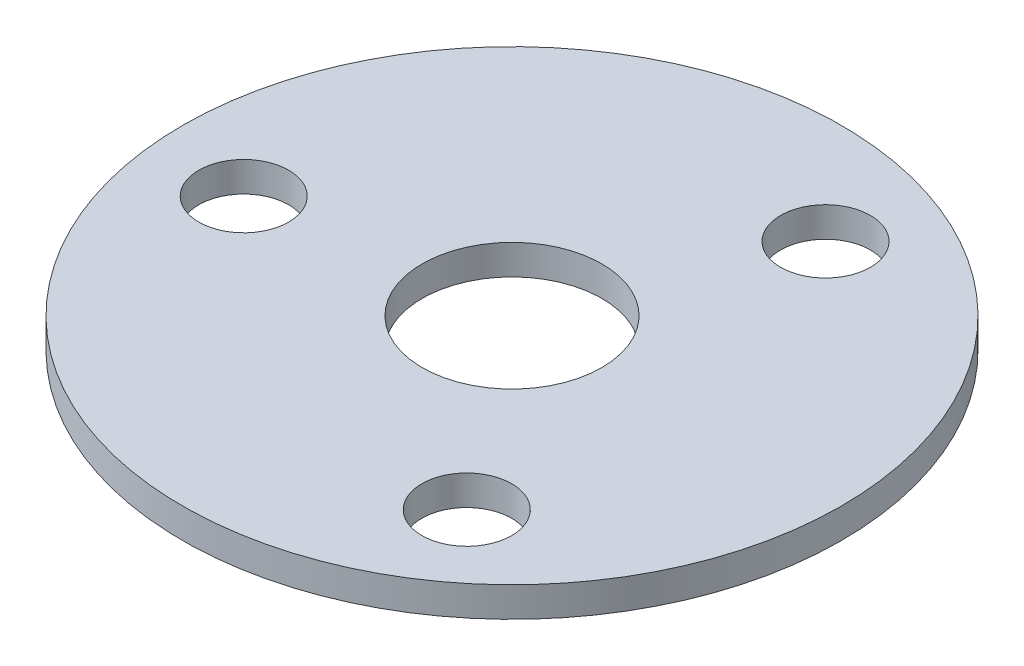
ISO-10303-21;
HEADER;
FILE_DESCRIPTION(('STEP AP214'),'2;1');
FILE_NAME('part.step','',(''),(''),'','','');
FILE_SCHEMA(('AUTOMOTIVE_DESIGN { 1 0 10303 214 1 1 1 1 }'));
ENDSEC;
DATA;
#1=APPLICATION_CONTEXT('core data for automotive mechanical design processes');
#2=APPLICATION_PROTOCOL_DEFINITION('international standard','automotive_design',2000,#1);
#3=PRODUCT_CONTEXT('',#1,'mechanical');
#4=PRODUCT('Part','Part','',(#3));
#5=PRODUCT_RELATED_PRODUCT_CATEGORY('part','',(#4));
#6=PRODUCT_DEFINITION_FORMATION('','',#4);
#7=PRODUCT_DEFINITION_CONTEXT('part definition',#1,'design');
#8=PRODUCT_DEFINITION('design','',#6,#7);
#9=PRODUCT_DEFINITION_SHAPE('','',#8);
#10=(LENGTH_UNIT() NAMED_UNIT(*) SI_UNIT(.MILLI.,.METRE.));
#11=(NAMED_UNIT(*) PLANE_ANGLE_UNIT() SI_UNIT($,.RADIAN.));
#12=(NAMED_UNIT(*) SI_UNIT($,.STERADIAN.) SOLID_ANGLE_UNIT());
#13=UNCERTAINTY_MEASURE_WITH_UNIT(LENGTH_MEASURE(1.E-05),#10,'distance_accuracy_value','');
#14=(GEOMETRIC_REPRESENTATION_CONTEXT(3) GLOBAL_UNCERTAINTY_ASSIGNED_CONTEXT((#13)) GLOBAL_UNIT_ASSIGNED_CONTEXT((#10,
#11,#12)) REPRESENTATION_CONTEXT('',''));
#15=CARTESIAN_POINT('',(0.,0.,0.));
#16=DIRECTION('',(0.,0.,1.));
#17=DIRECTION('',(1.,0.,0.));
#18=AXIS2_PLACEMENT_3D('',#15,#16,#17);
#19=CARTESIAN_POINT('',(1.00581535098195E-13,-94.,-2.66503618032686E-13));
#20=DIRECTION('',(0.,1.,0.));
#21=DIRECTION('',(0.991821591033947,0.,-0.127632016198486));
#22=AXIS2_PLACEMENT_3D('',#19,#20,#21);
#23=PLANE('',#22);
#24=CARTESIAN_POINT('',(-7.93457272827147,-94.,1.02105612958762));
#25=DIRECTION('',(0.,1.,0.));
#26=DIRECTION('',(0.991821591033947,0.,-0.127632016198486));
#27=AXIS2_PLACEMENT_3D('',#24,#25,#26);
#28=CIRCLE('',#27,1.5);
#29=CARTESIAN_POINT('',(-6.44684034172055,-94.,0.829608105289894));
#30=VERTEX_POINT('',#29);
#31=EDGE_CURVE('E65',#30,#30,#28,.T.);
#32=ORIENTED_EDGE('',*,*,#31,.F.);
#33=EDGE_LOOP('',(#32));
#34=FACE_BOUND('',#33,.T.);
#35=CARTESIAN_POINT('',(1.00581535098195E-13,-94.,-2.66503618032686E-13));
#36=DIRECTION('',(0.,1.,0.));
#37=DIRECTION('',(0.991821591033947,0.,-0.127632016198486));
#38=AXIS2_PLACEMENT_3D('',#35,#36,#37);
#39=CIRCLE('',#38,3.);
#40=CARTESIAN_POINT('',(2.97546477310194,-94.,-0.382896048595725));
#41=VERTEX_POINT('',#40);
#42=EDGE_CURVE('E52',#41,#41,#39,.T.);
#43=ORIENTED_EDGE('',*,*,#42,.F.);
#44=EDGE_LOOP('',(#43));
#45=FACE_BOUND('',#44,.T.);
#46=CARTESIAN_POINT('',(1.00581535098195E-13,-94.,-2.66503618032686E-13));
#47=DIRECTION('',(0.,1.,0.));
#48=DIRECTION('',(0.991821591033947,0.,-0.127632016198486));
#49=AXIS2_PLACEMENT_3D('',#46,#47,#48);
#50=CIRCLE('',#49,11.);
#51=CARTESIAN_POINT('',(10.9100375013735,-94.,-1.40395217818362));
#52=VERTEX_POINT('',#51);
#53=EDGE_CURVE('E10',#52,#52,#50,.T.);
#54=ORIENTED_EDGE('',*,*,#53,.T.);
#55=EDGE_LOOP('',(#54));
#56=FACE_BOUND('',#55,.T.);
#57=CARTESIAN_POINT('',(3.08302581722296,-94.,-7.3820696156526));
#58=DIRECTION('',(0.,1.,0.));
#59=DIRECTION('',(0.991821591033947,0.,-0.127632016198486));
#60=AXIS2_PLACEMENT_3D('',#57,#58,#59);
#61=CIRCLE('',#60,1.5);
#62=CARTESIAN_POINT('',(4.57075820377388,-94.,-7.57351763995033));
#63=VERTEX_POINT('',#62);
#64=EDGE_CURVE('E58',#63,#63,#61,.T.);
#65=ORIENTED_EDGE('',*,*,#64,.F.);
#66=EDGE_LOOP('',(#65));
#67=FACE_BOUND('',#66,.T.);
#68=CARTESIAN_POINT('',(4.85154691104882,-94.,6.36101348606417));
#69=DIRECTION('',(0.,1.,0.));
#70=DIRECTION('',(0.991821591033947,0.,-0.127632016198486));
#71=AXIS2_PLACEMENT_3D('',#68,#69,#70);
#72=CIRCLE('',#71,1.5);
#73=CARTESIAN_POINT('',(6.33927929759974,-94.,6.16956546176644));
#74=VERTEX_POINT('',#73);
#75=EDGE_CURVE('E71',#74,#74,#72,.T.);
#76=ORIENTED_EDGE('',*,*,#75,.F.);
#77=EDGE_LOOP('',(#76));
#78=FACE_BOUND('',#77,.T.);
#79=ADVANCED_FACE('F40',(#34,#45,#56,#67,#78),#23,.T.);
#80=CARTESIAN_POINT('',(0.,-95.,-2.65429199837879E-13));
#81=DIRECTION('',(0.,1.,0.));
#82=DIRECTION('',(0.991821591033947,0.,-0.127632016198486));
#83=AXIS2_PLACEMENT_3D('',#80,#81,#82);
#84=PLANE('',#83);
#85=CARTESIAN_POINT('',(0.,-95.,-2.65429199837879E-13));
#86=DIRECTION('',(0.,1.,0.));
#87=DIRECTION('',(0.991821591033947,0.,-0.127632016198486));
#88=AXIS2_PLACEMENT_3D('',#85,#86,#87);
#89=CIRCLE('',#88,11.);
#90=CARTESIAN_POINT('',(10.9100375013735,-95.,-1.40395217818361));
#91=VERTEX_POINT('',#90);
#92=EDGE_CURVE('E44',#91,#91,#89,.T.);
#93=ORIENTED_EDGE('',*,*,#92,.F.);
#94=EDGE_LOOP('',(#93));
#95=FACE_BOUND('',#94,.T.);
#96=CARTESIAN_POINT('',(0.,-95.,-2.65429199837879E-13));
#97=DIRECTION('',(0.,1.,0.));
#98=DIRECTION('',(0.991821591033947,0.,-0.127632016198486));
#99=AXIS2_PLACEMENT_3D('',#96,#97,#98);
#100=CIRCLE('',#99,3.);
#101=CARTESIAN_POINT('',(2.97546477310194,-95.,-0.382896048595724));
#102=VERTEX_POINT('',#101);
#103=EDGE_CURVE('E54',#102,#102,#100,.T.);
#104=ORIENTED_EDGE('',*,*,#103,.T.);
#105=EDGE_LOOP('',(#104));
#106=FACE_BOUND('',#105,.T.);
#107=CARTESIAN_POINT('',(3.08302581722296,-95.,-7.3820696156526));
#108=DIRECTION('',(0.,1.,0.));
#109=DIRECTION('',(0.991821591033947,0.,-0.127632016198486));
#110=AXIS2_PLACEMENT_3D('',#107,#108,#109);
#111=CIRCLE('',#110,1.5);
#112=CARTESIAN_POINT('',(4.57075820377388,-95.,-7.57351763995033));
#113=VERTEX_POINT('',#112);
#114=EDGE_CURVE('E61',#113,#113,#111,.T.);
#115=ORIENTED_EDGE('',*,*,#114,.T.);
#116=EDGE_LOOP('',(#115));
#117=FACE_BOUND('',#116,.T.);
#118=CARTESIAN_POINT('',(-7.93457272827147,-95.,1.02105612958762));
#119=DIRECTION('',(0.,1.,0.));
#120=DIRECTION('',(0.991821591033947,0.,-0.127632016198486));
#121=AXIS2_PLACEMENT_3D('',#118,#119,#120);
#122=CIRCLE('',#121,1.5);
#123=CARTESIAN_POINT('',(-6.44684034172055,-95.,0.829608105289895));
#124=VERTEX_POINT('',#123);
#125=EDGE_CURVE('E68',#124,#124,#122,.T.);
#126=ORIENTED_EDGE('',*,*,#125,.T.);
#127=EDGE_LOOP('',(#126));
#128=FACE_BOUND('',#127,.T.);
#129=CARTESIAN_POINT('',(4.85154691104882,-95.,6.36101348606417));
#130=DIRECTION('',(0.,1.,0.));
#131=DIRECTION('',(0.991821591033947,0.,-0.127632016198486));
#132=AXIS2_PLACEMENT_3D('',#129,#130,#131);
#133=CIRCLE('',#132,1.5);
#134=CARTESIAN_POINT('',(6.33927929759974,-95.,6.16956546176644));
#135=VERTEX_POINT('',#134);
#136=EDGE_CURVE('E74',#135,#135,#133,.T.);
#137=ORIENTED_EDGE('',*,*,#136,.T.);
#138=EDGE_LOOP('',(#137));
#139=FACE_BOUND('',#138,.T.);
#140=ADVANCED_FACE('F84',(#95,#106,#117,#128,#139),#84,.F.);
#141=CARTESIAN_POINT('',(1.00581535098195E-13,-94.,-2.66503618032686E-13));
#142=DIRECTION('',(0.,-1.,0.));
#143=DIRECTION('',(-0.991821591033947,0.,0.127632016198486));
#144=AXIS2_PLACEMENT_3D('',#141,#142,#143);
#145=CYLINDRICAL_SURFACE('',#144,11.);
#146=ORIENTED_EDGE('',*,*,#53,.F.);
#147=EDGE_LOOP('',(#146));
#148=FACE_BOUND('',#147,.T.);
#149=ORIENTED_EDGE('',*,*,#92,.T.);
#150=EDGE_LOOP('',(#149));
#151=FACE_BOUND('',#150,.T.);
#152=ADVANCED_FACE('F42',(#148,#151),#145,.T.);
#153=CARTESIAN_POINT('',(1.00581535098195E-13,-94.,-2.66503618032686E-13));
#154=DIRECTION('',(0.,-1.,0.));
#155=DIRECTION('',(-0.991821591033947,0.,0.127632016198486));
#156=AXIS2_PLACEMENT_3D('',#153,#154,#155);
#157=CYLINDRICAL_SURFACE('',#156,3.);
#158=ORIENTED_EDGE('',*,*,#42,.T.);
#159=EDGE_LOOP('',(#158));
#160=FACE_BOUND('',#159,.T.);
#161=ORIENTED_EDGE('',*,*,#103,.F.);
#162=EDGE_LOOP('',(#161));
#163=FACE_BOUND('',#162,.T.);
#164=ADVANCED_FACE('F94',(#160,#163),#157,.F.);
#165=CARTESIAN_POINT('',(3.08302581722296,-94.,-7.3820696156526));
#166=DIRECTION('',(0.,-1.,0.));
#167=DIRECTION('',(-0.991821591033947,0.,0.127632016198486));
#168=AXIS2_PLACEMENT_3D('',#165,#166,#167);
#169=CYLINDRICAL_SURFACE('',#168,1.5);
#170=ORIENTED_EDGE('',*,*,#64,.T.);
#171=EDGE_LOOP('',(#170));
#172=FACE_BOUND('',#171,.T.);
#173=ORIENTED_EDGE('',*,*,#114,.F.);
#174=EDGE_LOOP('',(#173));
#175=FACE_BOUND('',#174,.T.);
#176=ADVANCED_FACE('F97',(#172,#175),#169,.F.);
#177=CARTESIAN_POINT('',(-7.93457272827147,-94.,1.02105612958762));
#178=DIRECTION('',(0.,-1.,0.));
#179=DIRECTION('',(-0.991821591033947,0.,0.127632016198486));
#180=AXIS2_PLACEMENT_3D('',#177,#178,#179);
#181=CYLINDRICAL_SURFACE('',#180,1.5);
#182=ORIENTED_EDGE('',*,*,#31,.T.);
#183=EDGE_LOOP('',(#182));
#184=FACE_BOUND('',#183,.T.);
#185=ORIENTED_EDGE('',*,*,#125,.F.);
#186=EDGE_LOOP('',(#185));
#187=FACE_BOUND('',#186,.T.);
#188=ADVANCED_FACE('F101',(#184,#187),#181,.F.);
#189=CARTESIAN_POINT('',(4.85154691104882,-94.,6.36101348606417));
#190=DIRECTION('',(0.,-1.,0.));
#191=DIRECTION('',(-0.991821591033947,0.,0.127632016198486));
#192=AXIS2_PLACEMENT_3D('',#189,#190,#191);
#193=CYLINDRICAL_SURFACE('',#192,1.5);
#194=ORIENTED_EDGE('',*,*,#75,.T.);
#195=EDGE_LOOP('',(#194));
#196=FACE_BOUND('',#195,.T.);
#197=ORIENTED_EDGE('',*,*,#136,.F.);
#198=EDGE_LOOP('',(#197));
#199=FACE_BOUND('',#198,.T.);
#200=ADVANCED_FACE('F80',(#196,#199),#193,.F.);
#201=CLOSED_SHELL('',(#79,#140,#152,#164,#176,#188,#200));
#202=MANIFOLD_SOLID_BREP('B2',#201);
#203=ADVANCED_BREP_SHAPE_REPRESENTATION('',(#18,#202),#14);
#204=SHAPE_DEFINITION_REPRESENTATION(#9,#203);
ENDSEC;
END-ISO-10303-21;
